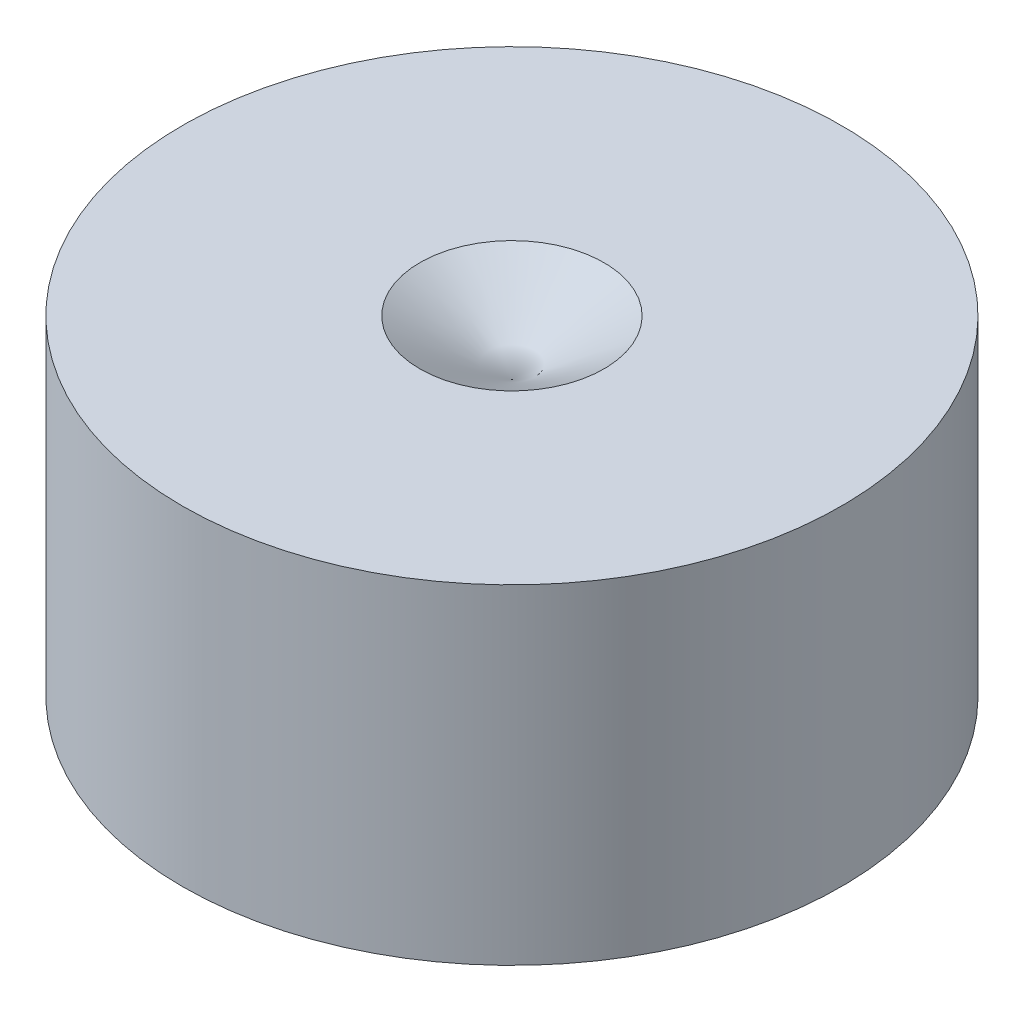
ISO-10303-21;
HEADER;
FILE_DESCRIPTION(('STEP AP214'),'2;1');
FILE_NAME('part.step','',(''),(''),'','','');
FILE_SCHEMA(('AUTOMOTIVE_DESIGN { 1 0 10303 214 1 1 1 1 }'));
ENDSEC;
DATA;
#1=APPLICATION_CONTEXT('core data for automotive mechanical design processes');
#2=APPLICATION_PROTOCOL_DEFINITION('international standard','automotive_design',2000,#1);
#3=PRODUCT_CONTEXT('',#1,'mechanical');
#4=PRODUCT('Part','Part','',(#3));
#5=PRODUCT_RELATED_PRODUCT_CATEGORY('part','',(#4));
#6=PRODUCT_DEFINITION_FORMATION('','',#4);
#7=PRODUCT_DEFINITION_CONTEXT('part definition',#1,'design');
#8=PRODUCT_DEFINITION('design','',#6,#7);
#9=PRODUCT_DEFINITION_SHAPE('','',#8);
#10=(LENGTH_UNIT() NAMED_UNIT(*) SI_UNIT(.MILLI.,.METRE.));
#11=(NAMED_UNIT(*) PLANE_ANGLE_UNIT() SI_UNIT($,.RADIAN.));
#12=(NAMED_UNIT(*) SI_UNIT($,.STERADIAN.) SOLID_ANGLE_UNIT());
#13=UNCERTAINTY_MEASURE_WITH_UNIT(LENGTH_MEASURE(1.E-05),#10,'distance_accuracy_value','');
#14=(GEOMETRIC_REPRESENTATION_CONTEXT(3) GLOBAL_UNCERTAINTY_ASSIGNED_CONTEXT((#13)) GLOBAL_UNIT_ASSIGNED_CONTEXT((#10,
#11,#12)) REPRESENTATION_CONTEXT('',''));
#15=CARTESIAN_POINT('',(0.,0.,0.));
#16=DIRECTION('',(0.,0.,1.));
#17=DIRECTION('',(1.,0.,0.));
#18=AXIS2_PLACEMENT_3D('',#15,#16,#17);
#19=CARTESIAN_POINT('',(0.,5.,0.));
#20=DIRECTION('',(0.,-1.,0.));
#21=DIRECTION('',(0.,0.,-1.));
#22=AXIS2_PLACEMENT_3D('',#19,#20,#21);
#23=CYLINDRICAL_SURFACE('',#22,5.);
#24=CARTESIAN_POINT('',(0.,5.,0.));
#25=DIRECTION('',(0.,1.,0.));
#26=DIRECTION('',(0.,0.,1.));
#27=AXIS2_PLACEMENT_3D('',#24,#25,#26);
#28=CIRCLE('',#27,5.);
#29=CARTESIAN_POINT('',(0.,5.,5.));
#30=VERTEX_POINT('',#29);
#31=EDGE_CURVE('E11',#30,#30,#28,.T.);
#32=ORIENTED_EDGE('',*,*,#31,.F.);
#33=EDGE_LOOP('',(#32));
#34=FACE_BOUND('',#33,.T.);
#35=CARTESIAN_POINT('',(0.,0.,0.));
#36=DIRECTION('',(0.,1.,0.));
#37=DIRECTION('',(0.,0.,1.));
#38=AXIS2_PLACEMENT_3D('',#35,#36,#37);
#39=CIRCLE('',#38,5.);
#40=CARTESIAN_POINT('',(0.,0.,5.));
#41=VERTEX_POINT('',#40);
#42=EDGE_CURVE('E40',#41,#41,#39,.T.);
#43=ORIENTED_EDGE('',*,*,#42,.T.);
#44=EDGE_LOOP('',(#43));
#45=FACE_BOUND('',#44,.T.);
#46=ADVANCED_FACE('F37',(#34,#45),#23,.T.);
#47=CARTESIAN_POINT('',(0.,5.,0.));
#48=DIRECTION('',(0.,1.,0.));
#49=DIRECTION('',(0.,0.,1.));
#50=AXIS2_PLACEMENT_3D('',#47,#48,#49);
#51=PLANE('',#50);
#52=CARTESIAN_POINT('',(0.,5.,0.));
#53=DIRECTION('',(0.,1.,0.));
#54=DIRECTION('',(0.,0.,1.));
#55=AXIS2_PLACEMENT_3D('',#52,#53,#54);
#56=CIRCLE('',#55,1.397);
#57=CARTESIAN_POINT('',(0.,5.,1.397));
#58=VERTEX_POINT('',#57);
#59=EDGE_CURVE('E53',#58,#58,#56,.T.);
#60=ORIENTED_EDGE('',*,*,#59,.F.);
#61=EDGE_LOOP('',(#60));
#62=FACE_BOUND('',#61,.T.);
#63=ORIENTED_EDGE('',*,*,#31,.T.);
#64=EDGE_LOOP('',(#63));
#65=FACE_BOUND('',#64,.T.);
#66=ADVANCED_FACE('F61',(#62,#65),#51,.T.);
#67=CARTESIAN_POINT('',(0.,0.,0.));
#68=DIRECTION('',(0.,1.,0.));
#69=DIRECTION('',(0.,0.,1.));
#70=AXIS2_PLACEMENT_3D('',#67,#68,#69);
#71=PLANE('',#70);
#72=ORIENTED_EDGE('',*,*,#42,.F.);
#73=EDGE_LOOP('',(#72));
#74=FACE_BOUND('',#73,.T.);
#75=ADVANCED_FACE('F49',(#74),#71,.F.);
#76=CARTESIAN_POINT('',(0.,5.,0.));
#77=DIRECTION('',(0.,1.,0.));
#78=DIRECTION('',(0.,0.,1.));
#79=AXIS2_PLACEMENT_3D('',#76,#77,#78);
#80=CONICAL_SURFACE('',#79,1.397,1.02974425867665);
#81=CARTESIAN_POINT('',(0.,4.1605977152185,0.));
#82=VERTEX_POINT('',#81);
#83=VERTEX_LOOP('',#82);
#84=FACE_BOUND('',#83,.T.);
#85=ORIENTED_EDGE('',*,*,#59,.T.);
#86=EDGE_LOOP('',(#85));
#87=FACE_BOUND('',#86,.T.);
#88=ADVANCED_FACE('F46',(#84,#87),#80,.F.);
#89=CLOSED_SHELL('',(#46,#66,#75,#88));
#90=MANIFOLD_SOLID_BREP('B2',#89);
#91=ADVANCED_BREP_SHAPE_REPRESENTATION('',(#18,#90),#14);
#92=SHAPE_DEFINITION_REPRESENTATION(#9,#91);
ENDSEC;
END-ISO-10303-21;
